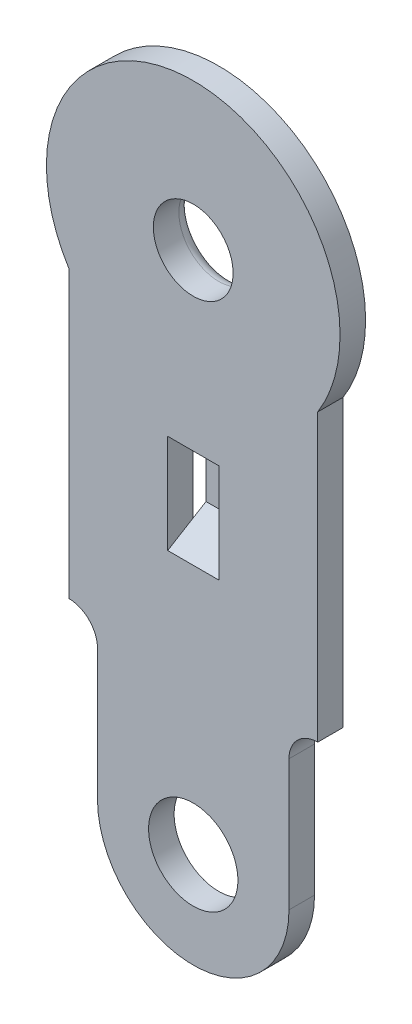
ISO-10303-21;
HEADER;
FILE_DESCRIPTION(('STEP AP214'),'2;1');
FILE_NAME('part.step','',(''),(''),'','','');
FILE_SCHEMA(('AUTOMOTIVE_DESIGN { 1 0 10303 214 1 1 1 1 }'));
ENDSEC;
DATA;
#1=APPLICATION_CONTEXT('core data for automotive mechanical design processes');
#2=APPLICATION_PROTOCOL_DEFINITION('international standard','automotive_design',2000,#1);
#3=PRODUCT_CONTEXT('',#1,'mechanical');
#4=PRODUCT('Part','Part','',(#3));
#5=PRODUCT_RELATED_PRODUCT_CATEGORY('part','',(#4));
#6=PRODUCT_DEFINITION_FORMATION('','',#4);
#7=PRODUCT_DEFINITION_CONTEXT('part definition',#1,'design');
#8=PRODUCT_DEFINITION('design','',#6,#7);
#9=PRODUCT_DEFINITION_SHAPE('','',#8);
#10=(LENGTH_UNIT() NAMED_UNIT(*) SI_UNIT(.MILLI.,.METRE.));
#11=(NAMED_UNIT(*) PLANE_ANGLE_UNIT() SI_UNIT($,.RADIAN.));
#12=(NAMED_UNIT(*) SI_UNIT($,.STERADIAN.) SOLID_ANGLE_UNIT());
#13=UNCERTAINTY_MEASURE_WITH_UNIT(LENGTH_MEASURE(1.E-05),#10,'distance_accuracy_value','');
#14=(GEOMETRIC_REPRESENTATION_CONTEXT(3) GLOBAL_UNCERTAINTY_ASSIGNED_CONTEXT((#13)) GLOBAL_UNIT_ASSIGNED_CONTEXT((#10,
#11,#12)) REPRESENTATION_CONTEXT('',''));
#15=CARTESIAN_POINT('',(0.,0.,0.));
#16=DIRECTION('',(0.,0.,1.));
#17=DIRECTION('',(1.,0.,0.));
#18=AXIS2_PLACEMENT_3D('',#15,#16,#17);
#19=CARTESIAN_POINT('',(0.4,-4.926669023956,-2.993348007763));
#20=DIRECTION('',(0.,-0.854621552333113,-0.519251386409069));
#21=DIRECTION('',(0.,0.519251386409069,-0.854621552333113));
#22=AXIS2_PLACEMENT_3D('',#19,#20,#21);
#23=PLANE('',#22);
#24=DIRECTION('',(0.,0.519251386403896,-0.854621552336256));
#25=VECTOR('',#24,1.);
#26=CARTESIAN_POINT('',(-0.4,1.787628044287,-14.04422458407));
#27=LINE('',#26,#25);
#28=CARTESIAN_POINT('',(-0.4,1.78762804428744,-14.0442245840744));
#29=VERTEX_POINT('',#28);
#30=CARTESIAN_POINT('',(-0.4,1.97692025313756,-14.3557754159206));
#31=VERTEX_POINT('',#30);
#32=EDGE_CURVE('E254',#29,#31,#27,.T.);
#33=ORIENTED_EDGE('',*,*,#32,.T.);
#34=DIRECTION('',(1.,0.,0.));
#35=VECTOR('',#34,1.);
#36=CARTESIAN_POINT('',(0.4,1.97692025313684,-14.3557754159207));
#37=LINE('',#36,#35);
#38=CARTESIAN_POINT('',(0.4,1.97692025313756,-14.3557754159206));
#39=VERTEX_POINT('',#38);
#40=EDGE_CURVE('E419',#39,#31,#37,.F.);
#41=ORIENTED_EDGE('',*,*,#40,.F.);
#42=DIRECTION('',(0.,0.519251386403896,-0.854621552336256));
#43=VECTOR('',#42,1.);
#44=CARTESIAN_POINT('',(0.4,1.787628044287,-14.04422458407));
#45=LINE('',#44,#43);
#46=CARTESIAN_POINT('',(0.4,1.78762804428744,-14.0442245840744));
#47=VERTEX_POINT('',#46);
#48=EDGE_CURVE('E207',#47,#39,#45,.T.);
#49=ORIENTED_EDGE('',*,*,#48,.F.);
#50=DIRECTION('',(-1.,0.,0.));
#51=VECTOR('',#50,1.);
#52=CARTESIAN_POINT('',(0.4,1.78762804428372,-14.044224584072));
#53=LINE('',#52,#51);
#54=EDGE_CURVE('E199',#47,#29,#53,.T.);
#55=ORIENTED_EDGE('',*,*,#54,.T.);
#56=EDGE_LOOP('',(#33,#41,#49,#55));
#57=FACE_BOUND('',#56,.T.);
#58=ADVANCED_FACE('F17',(#57),#23,.T.);
#59=CARTESIAN_POINT('',(0.4,2.233306718838,-14.2));
#60=DIRECTION('',(1.,0.,0.));
#61=DIRECTION('',(0.,0.,-1.));
#62=AXIS2_PLACEMENT_3D('',#59,#60,#61);
#63=CYLINDRICAL_SURFACE('',#62,0.3);
#64=DIRECTION('',(-1.,0.,0.));
#65=VECTOR('',#64,1.);
#66=CARTESIAN_POINT('',(0.4,2.233306718838,-14.5));
#67=LINE('',#66,#65);
#68=CARTESIAN_POINT('',(0.4,2.233306718838,-14.5));
#69=VERTEX_POINT('',#68);
#70=CARTESIAN_POINT('',(-0.4,2.233306718838,-14.5));
#71=VERTEX_POINT('',#70);
#72=EDGE_CURVE('E417',#69,#71,#67,.T.);
#73=ORIENTED_EDGE('',*,*,#72,.F.);
#74=CARTESIAN_POINT('',(0.4,2.233306718838,-14.2));
#75=DIRECTION('',(1.,0.,0.));
#76=DIRECTION('',(0.,0.,-1.));
#77=AXIS2_PLACEMENT_3D('',#74,#75,#76);
#78=CIRCLE('',#77,0.3);
#79=EDGE_CURVE('E265',#39,#69,#78,.T.);
#80=ORIENTED_EDGE('',*,*,#79,.F.);
#81=ORIENTED_EDGE('',*,*,#40,.T.);
#82=CARTESIAN_POINT('',(-0.4,2.233306718838,-14.2));
#83=DIRECTION('',(1.,0.,0.));
#84=DIRECTION('',(0.,0.,-1.));
#85=AXIS2_PLACEMENT_3D('',#82,#83,#84);
#86=CIRCLE('',#85,0.3);
#87=EDGE_CURVE('E253',#31,#71,#86,.T.);
#88=ORIENTED_EDGE('',*,*,#87,.T.);
#89=EDGE_LOOP('',(#73,#80,#81,#88));
#90=FACE_BOUND('',#89,.T.);
#91=ADVANCED_FACE('F474',(#90),#63,.T.);
#92=CARTESIAN_POINT('',(0.4,0.,-14.5));
#93=DIRECTION('',(0.,0.,-1.));
#94=DIRECTION('',(-1.,0.,0.));
#95=AXIS2_PLACEMENT_3D('',#92,#93,#94);
#96=PLANE('',#95);
#97=DIRECTION('',(1.,0.,0.));
#98=VECTOR('',#97,1.);
#99=CARTESIAN_POINT('',(0.4,3.166693281162,-14.5));
#100=LINE('',#99,#98);
#101=CARTESIAN_POINT('',(0.4,3.166693281162,-14.5));
#102=VERTEX_POINT('',#101);
#103=CARTESIAN_POINT('',(-0.4,3.166693281162,-14.5));
#104=VERTEX_POINT('',#103);
#105=EDGE_CURVE('E415',#102,#104,#100,.F.);
#106=ORIENTED_EDGE('',*,*,#105,.F.);
#107=DIRECTION('',(0.,1.,0.));
#108=VECTOR('',#107,1.);
#109=CARTESIAN_POINT('',(0.4,0.,-14.5));
#110=LINE('',#109,#108);
#111=EDGE_CURVE('E263',#69,#102,#110,.T.);
#112=ORIENTED_EDGE('',*,*,#111,.F.);
#113=ORIENTED_EDGE('',*,*,#72,.T.);
#114=DIRECTION('',(0.,1.,0.));
#115=VECTOR('',#114,1.);
#116=CARTESIAN_POINT('',(-0.4,0.,-14.5));
#117=LINE('',#116,#115);
#118=EDGE_CURVE('E250',#71,#104,#117,.T.);
#119=ORIENTED_EDGE('',*,*,#118,.T.);
#120=EDGE_LOOP('',(#106,#112,#113,#119));
#121=FACE_BOUND('',#120,.T.);
#122=ADVANCED_FACE('F478',(#121),#96,.T.);
#123=CARTESIAN_POINT('',(0.4,3.166693281162,-14.2));
#124=DIRECTION('',(1.,0.,0.));
#125=DIRECTION('',(0.,0.,-1.));
#126=AXIS2_PLACEMENT_3D('',#123,#124,#125);
#127=CYLINDRICAL_SURFACE('',#126,0.3);
#128=DIRECTION('',(1.,0.,0.));
#129=VECTOR('',#128,1.);
#130=CARTESIAN_POINT('',(0.4,3.42307974686397,-14.3557754159212));
#131=LINE('',#130,#129);
#132=CARTESIAN_POINT('',(0.4,3.42307974686284,-14.3557754159208));
#133=VERTEX_POINT('',#132);
#134=CARTESIAN_POINT('',(-0.4,3.42307974686284,-14.3557754159208));
#135=VERTEX_POINT('',#134);
#136=EDGE_CURVE('E413',#133,#135,#131,.F.);
#137=ORIENTED_EDGE('',*,*,#136,.F.);
#138=CARTESIAN_POINT('',(0.4,3.166693281162,-14.2));
#139=DIRECTION('',(1.,0.,0.));
#140=DIRECTION('',(0.,0.,-1.));
#141=AXIS2_PLACEMENT_3D('',#138,#139,#140);
#142=CIRCLE('',#141,0.3);
#143=EDGE_CURVE('E186',#102,#133,#142,.T.);
#144=ORIENTED_EDGE('',*,*,#143,.F.);
#145=ORIENTED_EDGE('',*,*,#105,.T.);
#146=CARTESIAN_POINT('',(-0.4,3.166693281162,-14.2));
#147=DIRECTION('',(1.,0.,0.));
#148=DIRECTION('',(0.,0.,-1.));
#149=AXIS2_PLACEMENT_3D('',#146,#147,#148);
#150=CIRCLE('',#149,0.3);
#151=EDGE_CURVE('E249',#104,#135,#150,.T.);
#152=ORIENTED_EDGE('',*,*,#151,.T.);
#153=EDGE_LOOP('',(#137,#144,#145,#152));
#154=FACE_BOUND('',#153,.T.);
#155=ADVANCED_FACE('F481',(#154),#127,.T.);
#156=CARTESIAN_POINT('',(0.4,8.870710211602,-5.389670507645));
#157=DIRECTION('',(0.,0.854621552333113,-0.519251386409069));
#158=DIRECTION('',(0.,0.519251386409069,0.854621552333113));
#159=AXIS2_PLACEMENT_3D('',#156,#157,#158);
#160=PLANE('',#159);
#161=DIRECTION('',(0.,0.519251386403898,0.854621552336255));
#162=VECTOR('',#161,1.);
#163=CARTESIAN_POINT('',(0.4,3.423079746862,-14.35577541592));
#164=LINE('',#163,#162);
#165=CARTESIAN_POINT('',(0.4,3.61237195571256,-14.0442245840744));
#166=VERTEX_POINT('',#165);
#167=EDGE_CURVE('E179',#133,#166,#164,.T.);
#168=ORIENTED_EDGE('',*,*,#167,.F.);
#169=ORIENTED_EDGE('',*,*,#136,.T.);
#170=DIRECTION('',(0.,0.519251386403898,0.854621552336255));
#171=VECTOR('',#170,1.);
#172=CARTESIAN_POINT('',(-0.4,3.423079746862,-14.35577541592));
#173=LINE('',#172,#171);
#174=CARTESIAN_POINT('',(-0.4,3.61237195571256,-14.0442245840744));
#175=VERTEX_POINT('',#174);
#176=EDGE_CURVE('E194',#135,#175,#173,.T.);
#177=ORIENTED_EDGE('',*,*,#176,.T.);
#178=DIRECTION('',(1.,0.,0.));
#179=VECTOR('',#178,1.);
#180=CARTESIAN_POINT('',(0.4,3.61237195571628,-14.044224584072));
#181=LINE('',#180,#179);
#182=EDGE_CURVE('E191',#175,#166,#181,.T.);
#183=ORIENTED_EDGE('',*,*,#182,.T.);
#184=EDGE_LOOP('',(#168,#169,#177,#183));
#185=FACE_BOUND('',#184,.T.);
#186=ADVANCED_FACE('F192',(#185),#160,.T.);
#187=CARTESIAN_POINT('',(0.4,1.531241578587,-14.2));
#188=DIRECTION('',(-1.,0.,0.));
#189=DIRECTION('',(0.,0.,1.));
#190=AXIS2_PLACEMENT_3D('',#187,#188,#189);
#191=CYLINDRICAL_SURFACE('',#190,0.3);
#192=DIRECTION('',(-1.,0.,0.));
#193=VECTOR('',#192,1.);
#194=CARTESIAN_POINT('',(0.,1.531241578587,-13.9));
#195=LINE('',#194,#193);
#196=CARTESIAN_POINT('',(-0.4,1.531241578587,-13.9));
#197=VERTEX_POINT('',#196);
#198=CARTESIAN_POINT('',(0.4,1.531241578587,-13.9));
#199=VERTEX_POINT('',#198);
#200=EDGE_CURVE('E384',#197,#199,#195,.F.);
#201=ORIENTED_EDGE('',*,*,#200,.F.);
#202=CARTESIAN_POINT('',(-0.4,1.531241578587,-14.2));
#203=DIRECTION('',(-1.,0.,0.));
#204=DIRECTION('',(0.,0.,1.));
#205=AXIS2_PLACEMENT_3D('',#202,#203,#204);
#206=CIRCLE('',#205,0.3);
#207=EDGE_CURVE('E257',#197,#29,#206,.T.);
#208=ORIENTED_EDGE('',*,*,#207,.T.);
#209=ORIENTED_EDGE('',*,*,#54,.F.);
#210=CARTESIAN_POINT('',(0.4,1.531241578587,-14.2));
#211=DIRECTION('',(-1.,0.,0.));
#212=DIRECTION('',(0.,0.,1.));
#213=AXIS2_PLACEMENT_3D('',#210,#211,#212);
#214=CIRCLE('',#213,0.3);
#215=EDGE_CURVE('E204',#199,#47,#214,.T.);
#216=ORIENTED_EDGE('',*,*,#215,.F.);
#217=EDGE_LOOP('',(#201,#208,#209,#216));
#218=FACE_BOUND('',#217,.T.);
#219=ADVANCED_FACE('F756',(#218),#191,.F.);
#220=CARTESIAN_POINT('',(0.4,3.868758421413,-14.2));
#221=DIRECTION('',(1.,0.,0.));
#222=DIRECTION('',(0.,0.,-1.));
#223=AXIS2_PLACEMENT_3D('',#220,#221,#222);
#224=CYLINDRICAL_SURFACE('',#223,0.3);
#225=DIRECTION('',(-1.,0.,0.));
#226=VECTOR('',#225,1.);
#227=CARTESIAN_POINT('',(0.,3.868758421413,-13.9));
#228=LINE('',#227,#226);
#229=CARTESIAN_POINT('',(0.4,3.868758421413,-13.9));
#230=VERTEX_POINT('',#229);
#231=CARTESIAN_POINT('',(-0.4,3.868758421413,-13.9));
#232=VERTEX_POINT('',#231);
#233=EDGE_CURVE('E203',#230,#232,#228,.T.);
#234=ORIENTED_EDGE('',*,*,#233,.F.);
#235=CARTESIAN_POINT('',(0.4,3.868758421413,-14.2));
#236=DIRECTION('',(1.,0.,0.));
#237=DIRECTION('',(0.,0.,-1.));
#238=AXIS2_PLACEMENT_3D('',#235,#236,#237);
#239=CIRCLE('',#238,0.3);
#240=EDGE_CURVE('E183',#166,#230,#239,.F.);
#241=ORIENTED_EDGE('',*,*,#240,.F.);
#242=ORIENTED_EDGE('',*,*,#182,.F.);
#243=CARTESIAN_POINT('',(-0.4,3.868758421413,-14.2));
#244=DIRECTION('',(1.,0.,0.));
#245=DIRECTION('',(0.,0.,-1.));
#246=AXIS2_PLACEMENT_3D('',#243,#244,#245);
#247=CIRCLE('',#246,0.3);
#248=EDGE_CURVE('E248',#175,#232,#247,.F.);
#249=ORIENTED_EDGE('',*,*,#248,.T.);
#250=EDGE_LOOP('',(#234,#241,#242,#249));
#251=FACE_BOUND('',#250,.T.);
#252=ADVANCED_FACE('F202',(#251),#224,.F.);
#253=CARTESIAN_POINT('',(0.,6.2,-13.9));
#254=DIRECTION('',(0.,0.,-1.));
#255=DIRECTION('',(-1.,0.,0.));
#256=AXIS2_PLACEMENT_3D('',#253,#254,#255);
#257=TOROIDAL_SURFACE('',#256,1.3,0.2);
#258=CARTESIAN_POINT('',(0.,6.2,-13.9));
#259=DIRECTION('',(0.,0.,-1.));
#260=DIRECTION('',(-1.,0.,0.));
#261=AXIS2_PLACEMENT_3D('',#258,#259,#260);
#262=CIRCLE('',#261,1.5);
#263=CARTESIAN_POINT('',(-1.5,6.2,-13.9));
#264=VERTEX_POINT('',#263);
#265=EDGE_CURVE('E345',#264,#264,#262,.F.);
#266=ORIENTED_EDGE('',*,*,#265,.F.);
#267=EDGE_LOOP('',(#266));
#268=FACE_BOUND('',#267,.T.);
#269=CARTESIAN_POINT('',(0.,6.2,-14.1));
#270=DIRECTION('',(0.,0.,1.));
#271=DIRECTION('',(-1.,0.,0.));
#272=AXIS2_PLACEMENT_3D('',#269,#270,#271);
#273=CIRCLE('',#272,1.3);
#274=CARTESIAN_POINT('',(1.3,6.2,-14.1));
#275=VERTEX_POINT('',#274);
#276=CARTESIAN_POINT('',(-1.3,6.2,-14.1));
#277=VERTEX_POINT('',#276);
#278=EDGE_CURVE('E188',#275,#277,#273,.F.);
#279=ORIENTED_EDGE('',*,*,#278,.F.);
#280=CARTESIAN_POINT('',(0.,6.2,-14.1));
#281=DIRECTION('',(0.,0.,1.));
#282=DIRECTION('',(1.,0.,0.));
#283=AXIS2_PLACEMENT_3D('',#280,#281,#282);
#284=CIRCLE('',#283,1.3);
#285=EDGE_CURVE('E198',#277,#275,#284,.F.);
#286=ORIENTED_EDGE('',*,*,#285,.F.);
#287=EDGE_LOOP('',(#279,#286));
#288=FACE_BOUND('',#287,.T.);
#289=ADVANCED_FACE('F301',(#268,#288),#257,.T.);
#290=CARTESIAN_POINT('',(0.,6.2,-14.1));
#291=DIRECTION('',(0.,0.,-1.));
#292=DIRECTION('',(-1.,0.,0.));
#293=AXIS2_PLACEMENT_3D('',#290,#291,#292);
#294=PLANE('',#293);
#295=CARTESIAN_POINT('',(0.,6.2,-14.1));
#296=DIRECTION('',(0.,0.,-1.));
#297=DIRECTION('',(1.,0.,0.));
#298=AXIS2_PLACEMENT_3D('',#295,#296,#297);
#299=CIRCLE('',#298,0.825);
#300=CARTESIAN_POINT('',(0.825,6.2,-14.1));
#301=VERTEX_POINT('',#300);
#302=CARTESIAN_POINT('',(-0.825,6.2,-14.1));
#303=VERTEX_POINT('',#302);
#304=EDGE_CURVE('E331',#301,#303,#299,.T.);
#305=ORIENTED_EDGE('',*,*,#304,.F.);
#306=CARTESIAN_POINT('',(0.,6.2,-14.1));
#307=DIRECTION('',(0.,0.,-1.));
#308=DIRECTION('',(-1.,0.,0.));
#309=AXIS2_PLACEMENT_3D('',#306,#307,#308);
#310=CIRCLE('',#309,0.825);
#311=EDGE_CURVE('E214',#303,#301,#310,.T.);
#312=ORIENTED_EDGE('',*,*,#311,.F.);
#313=EDGE_LOOP('',(#305,#312));
#314=FACE_BOUND('',#313,.T.);
#315=ORIENTED_EDGE('',*,*,#285,.T.);
#316=ORIENTED_EDGE('',*,*,#278,.T.);
#317=EDGE_LOOP('',(#315,#316));
#318=FACE_BOUND('',#317,.T.);
#319=ADVANCED_FACE('F292',(#314,#318),#294,.T.);
#320=CARTESIAN_POINT('',(0.4,0.,0.));
#321=DIRECTION('',(1.,0.,0.));
#322=DIRECTION('',(0.,0.,-1.));
#323=AXIS2_PLACEMENT_3D('',#320,#321,#322);
#324=PLANE('',#323);
#325=ORIENTED_EDGE('',*,*,#111,.T.);
#326=ORIENTED_EDGE('',*,*,#143,.T.);
#327=ORIENTED_EDGE('',*,*,#167,.T.);
#328=ORIENTED_EDGE('',*,*,#240,.T.);
#329=DIRECTION('',(0.,1.,0.));
#330=VECTOR('',#329,1.);
#331=CARTESIAN_POINT('',(0.4,6.2,-13.9));
#332=LINE('',#331,#330);
#333=CARTESIAN_POINT('',(0.4,3.23195657316606,-13.9));
#334=VERTEX_POINT('',#333);
#335=EDGE_CURVE('E343',#334,#230,#332,.T.);
#336=ORIENTED_EDGE('',*,*,#335,.F.);
#337=DIRECTION('',(0.,0.519251386409069,0.854621552333113));
#338=VECTOR('',#337,1.);
#339=CARTESIAN_POINT('',(0.4,8.528861590668,-5.181969953082));
#340=LINE('',#339,#338);
#341=CARTESIAN_POINT('',(0.4,3.11044047402501,-14.1));
#342=VERTEX_POINT('',#341);
#343=EDGE_CURVE('E376',#334,#342,#340,.F.);
#344=ORIENTED_EDGE('',*,*,#343,.T.);
#345=DIRECTION('',(0.,1.,0.));
#346=VECTOR('',#345,1.);
#347=CARTESIAN_POINT('',(0.4,0.,-14.1));
#348=LINE('',#347,#346);
#349=CARTESIAN_POINT('',(0.4,2.28955952597479,-14.1000000000001));
#350=VERTEX_POINT('',#349);
#351=EDGE_CURVE('E260',#342,#350,#348,.F.);
#352=ORIENTED_EDGE('',*,*,#351,.T.);
#353=DIRECTION('',(0.,0.519251386409069,-0.854621552333113));
#354=VECTOR('',#353,1.);
#355=CARTESIAN_POINT('',(0.4,-4.584820403023,-2.7856474532));
#356=LINE('',#355,#354);
#357=CARTESIAN_POINT('',(0.4,2.16804342683369,-13.9));
#358=VERTEX_POINT('',#357);
#359=EDGE_CURVE('E351',#350,#358,#356,.F.);
#360=ORIENTED_EDGE('',*,*,#359,.T.);
#361=DIRECTION('',(0.,1.,0.));
#362=VECTOR('',#361,1.);
#363=CARTESIAN_POINT('',(0.4,6.2,-13.9));
#364=LINE('',#363,#362);
#365=EDGE_CURVE('E367',#199,#358,#364,.T.);
#366=ORIENTED_EDGE('',*,*,#365,.F.);
#367=ORIENTED_EDGE('',*,*,#215,.T.);
#368=ORIENTED_EDGE('',*,*,#48,.T.);
#369=ORIENTED_EDGE('',*,*,#79,.T.);
#370=EDGE_LOOP('',(#325,#326,#327,#328,#336,#344,#352,#360,#366,#367,#368,#369));
#371=FACE_BOUND('',#370,.T.);
#372=ADVANCED_FACE('F181',(#371),#324,.T.);
#373=CARTESIAN_POINT('',(0.4,0.,-14.1));
#374=DIRECTION('',(0.,0.,-1.));
#375=DIRECTION('',(-1.,0.,0.));
#376=AXIS2_PLACEMENT_3D('',#373,#374,#375);
#377=PLANE('',#376);
#378=DIRECTION('',(0.,1.,0.));
#379=VECTOR('',#378,1.);
#380=CARTESIAN_POINT('',(-0.4,0.,-14.1));
#381=LINE('',#380,#379);
#382=CARTESIAN_POINT('',(-0.4,3.11044047402501,-14.1));
#383=VERTEX_POINT('',#382);
#384=CARTESIAN_POINT('',(-0.4,2.28955952597479,-14.1000000000001));
#385=VERTEX_POINT('',#384);
#386=EDGE_CURVE('E258',#383,#385,#381,.F.);
#387=ORIENTED_EDGE('',*,*,#386,.T.);
#388=DIRECTION('',(1.,0.,0.));
#389=VECTOR('',#388,1.);
#390=CARTESIAN_POINT('',(0.4,2.28955952597416,-14.1000000000005));
#391=LINE('',#390,#389);
#392=EDGE_CURVE('E397',#385,#350,#391,.T.);
#393=ORIENTED_EDGE('',*,*,#392,.T.);
#394=ORIENTED_EDGE('',*,*,#351,.F.);
#395=DIRECTION('',(1.,0.,0.));
#396=VECTOR('',#395,1.);
#397=CARTESIAN_POINT('',(0.4,3.11044047402505,-14.1));
#398=LINE('',#397,#396);
#399=EDGE_CURVE('E363',#342,#383,#398,.F.);
#400=ORIENTED_EDGE('',*,*,#399,.T.);
#401=EDGE_LOOP('',(#387,#393,#394,#400));
#402=FACE_BOUND('',#401,.T.);
#403=ADVANCED_FACE('F723',(#402),#377,.F.);
#404=CARTESIAN_POINT('',(-0.4,0.,0.));
#405=DIRECTION('',(1.,0.,0.));
#406=DIRECTION('',(0.,0.,-1.));
#407=AXIS2_PLACEMENT_3D('',#404,#405,#406);
#408=PLANE('',#407);
#409=ORIENTED_EDGE('',*,*,#248,.F.);
#410=ORIENTED_EDGE('',*,*,#176,.F.);
#411=ORIENTED_EDGE('',*,*,#151,.F.);
#412=ORIENTED_EDGE('',*,*,#118,.F.);
#413=ORIENTED_EDGE('',*,*,#87,.F.);
#414=ORIENTED_EDGE('',*,*,#32,.F.);
#415=ORIENTED_EDGE('',*,*,#207,.F.);
#416=DIRECTION('',(0.,1.,0.));
#417=VECTOR('',#416,1.);
#418=CARTESIAN_POINT('',(-0.4,6.2,-13.9));
#419=LINE('',#418,#417);
#420=CARTESIAN_POINT('',(-0.4,2.16804342683384,-13.9));
#421=VERTEX_POINT('',#420);
#422=EDGE_CURVE('E386',#421,#197,#419,.F.);
#423=ORIENTED_EDGE('',*,*,#422,.F.);
#424=DIRECTION('',(0.,0.519251386409069,-0.854621552333113));
#425=VECTOR('',#424,1.);
#426=CARTESIAN_POINT('',(-0.4,-4.584820403023,-2.7856474532));
#427=LINE('',#426,#425);
#428=EDGE_CURVE('E404',#421,#385,#427,.T.);
#429=ORIENTED_EDGE('',*,*,#428,.T.);
#430=ORIENTED_EDGE('',*,*,#386,.F.);
#431=DIRECTION('',(0.,0.519251386409069,0.854621552333113));
#432=VECTOR('',#431,1.);
#433=CARTESIAN_POINT('',(-0.4,8.528861590668,-5.181969953082));
#434=LINE('',#433,#432);
#435=CARTESIAN_POINT('',(-0.4,3.23195657316606,-13.9));
#436=VERTEX_POINT('',#435);
#437=EDGE_CURVE('E358',#383,#436,#434,.T.);
#438=ORIENTED_EDGE('',*,*,#437,.T.);
#439=DIRECTION('',(0.,1.,0.));
#440=VECTOR('',#439,1.);
#441=CARTESIAN_POINT('',(-0.4,6.2,-13.9));
#442=LINE('',#441,#440);
#443=EDGE_CURVE('E342',#232,#436,#442,.F.);
#444=ORIENTED_EDGE('',*,*,#443,.F.);
#445=EDGE_LOOP('',(#409,#410,#411,#412,#413,#414,#415,#423,#429,#430,#438,#444));
#446=FACE_BOUND('',#445,.T.);
#447=ADVANCED_FACE('F483',(#446),#408,.F.);
#448=CARTESIAN_POINT('',(0.,6.2,-13.9));
#449=DIRECTION('',(0.,0.,-1.));
#450=DIRECTION('',(-1.,0.,0.));
#451=AXIS2_PLACEMENT_3D('',#448,#449,#450);
#452=PLANE('',#451);
#453=ORIENTED_EDGE('',*,*,#265,.T.);
#454=EDGE_LOOP('',(#453));
#455=FACE_BOUND('',#454,.T.);
#456=CARTESIAN_POINT('',(0.,-2.,-13.9));
#457=DIRECTION('',(0.,0.,-1.));
#458=DIRECTION('',(-1.,0.,0.));
#459=AXIS2_PLACEMENT_3D('',#456,#457,#458);
#460=CIRCLE('',#459,0.7);
#461=CARTESIAN_POINT('',(-0.7,-2.,-13.9));
#462=VERTEX_POINT('',#461);
#463=EDGE_CURVE('E246',#462,#462,#460,.F.);
#464=ORIENTED_EDGE('',*,*,#463,.T.);
#465=EDGE_LOOP('',(#464));
#466=FACE_BOUND('',#465,.T.);
#467=ORIENTED_EDGE('',*,*,#443,.T.);
#468=DIRECTION('',(0.,-1.,0.));
#469=VECTOR('',#468,1.);
#470=CARTESIAN_POINT('',(-0.4,3.7,-13.9));
#471=LINE('',#470,#469);
#472=EDGE_CURVE('E348',#436,#421,#471,.T.);
#473=ORIENTED_EDGE('',*,*,#472,.T.);
#474=ORIENTED_EDGE('',*,*,#422,.T.);
#475=ORIENTED_EDGE('',*,*,#200,.T.);
#476=ORIENTED_EDGE('',*,*,#365,.T.);
#477=DIRECTION('',(0.,1.,0.));
#478=VECTOR('',#477,1.);
#479=CARTESIAN_POINT('',(0.4,3.7,-13.9));
#480=LINE('',#479,#478);
#481=EDGE_CURVE('E370',#358,#334,#480,.T.);
#482=ORIENTED_EDGE('',*,*,#481,.T.);
#483=ORIENTED_EDGE('',*,*,#335,.T.);
#484=ORIENTED_EDGE('',*,*,#233,.T.);
#485=EDGE_LOOP('',(#467,#473,#474,#475,#476,#482,#483,#484));
#486=FACE_BOUND('',#485,.T.);
#487=CARTESIAN_POINT('',(-1.95,0.05,-13.9));
#488=DIRECTION('',(0.,0.,-1.));
#489=DIRECTION('',(-1.,0.,0.));
#490=AXIS2_PLACEMENT_3D('',#487,#488,#489);
#491=CIRCLE('',#490,0.45);
#492=CARTESIAN_POINT('',(-1.5,0.05,-13.9));
#493=VERTEX_POINT('',#492);
#494=CARTESIAN_POINT('',(-1.95,0.5,-13.9));
#495=VERTEX_POINT('',#494);
#496=EDGE_CURVE('E452',#493,#495,#491,.F.);
#497=ORIENTED_EDGE('',*,*,#496,.T.);
#498=DIRECTION('',(0.,1.,0.));
#499=VECTOR('',#498,1.);
#500=CARTESIAN_POINT('',(-1.95,4.980368908235,-13.9));
#501=LINE('',#500,#499);
#502=CARTESIAN_POINT('',(-1.95000000000001,4.98036890823497,-13.9));
#503=VERTEX_POINT('',#502);
#504=EDGE_CURVE('E267',#495,#503,#501,.T.);
#505=ORIENTED_EDGE('',*,*,#504,.T.);
#506=CARTESIAN_POINT('',(0.,6.2,-13.9));
#507=DIRECTION('',(0.,0.,-1.));
#508=DIRECTION('',(-1.,0.,0.));
#509=AXIS2_PLACEMENT_3D('',#506,#507,#508);
#510=CIRCLE('',#509,2.3);
#511=CARTESIAN_POINT('',(1.95,4.98036890823498,-13.9));
#512=VERTEX_POINT('',#511);
#513=EDGE_CURVE('E270',#512,#503,#510,.F.);
#514=ORIENTED_EDGE('',*,*,#513,.F.);
#515=DIRECTION('',(0.,-1.,0.));
#516=VECTOR('',#515,1.);
#517=CARTESIAN_POINT('',(1.95,4.980368908235,-13.9));
#518=LINE('',#517,#516);
#519=CARTESIAN_POINT('',(1.95,0.5,-13.9));
#520=VERTEX_POINT('',#519);
#521=EDGE_CURVE('E281',#512,#520,#518,.T.);
#522=ORIENTED_EDGE('',*,*,#521,.T.);
#523=CARTESIAN_POINT('',(1.95,0.05,-13.9));
#524=DIRECTION('',(0.,0.,-1.));
#525=DIRECTION('',(-1.,0.,0.));
#526=AXIS2_PLACEMENT_3D('',#523,#524,#525);
#527=CIRCLE('',#526,0.45);
#528=CARTESIAN_POINT('',(1.5,0.05,-13.9));
#529=VERTEX_POINT('',#528);
#530=EDGE_CURVE('E456',#520,#529,#527,.F.);
#531=ORIENTED_EDGE('',*,*,#530,.T.);
#532=DIRECTION('',(0.,1.,0.));
#533=VECTOR('',#532,1.);
#534=CARTESIAN_POINT('',(1.5,0.05,-13.9));
#535=LINE('',#534,#533);
#536=CARTESIAN_POINT('',(1.5,-2.,-13.9));
#537=VERTEX_POINT('',#536);
#538=EDGE_CURVE('E276',#529,#537,#535,.F.);
#539=ORIENTED_EDGE('',*,*,#538,.T.);
#540=CARTESIAN_POINT('',(0.,-2.,-13.9));
#541=DIRECTION('',(0.,0.,-1.));
#542=DIRECTION('',(-1.,0.,0.));
#543=AXIS2_PLACEMENT_3D('',#540,#541,#542);
#544=CIRCLE('',#543,1.5);
#545=CARTESIAN_POINT('',(-1.5,-2.,-13.9));
#546=VERTEX_POINT('',#545);
#547=EDGE_CURVE('E279',#546,#537,#544,.F.);
#548=ORIENTED_EDGE('',*,*,#547,.F.);
#549=DIRECTION('',(0.,1.,0.));
#550=VECTOR('',#549,1.);
#551=CARTESIAN_POINT('',(-1.5,0.05,-13.9));
#552=LINE('',#551,#550);
#553=EDGE_CURVE('E272',#546,#493,#552,.T.);
#554=ORIENTED_EDGE('',*,*,#553,.T.);
#555=EDGE_LOOP('',(#497,#505,#514,#522,#531,#539,#548,#554));
#556=FACE_BOUND('',#555,.T.);
#557=ADVANCED_FACE('F232',(#455,#466,#486,#556),#452,.T.);
#558=CARTESIAN_POINT('',(0.,6.2,-13.9));
#559=DIRECTION('',(0.,0.,-1.));
#560=DIRECTION('',(-1.,0.,0.));
#561=AXIS2_PLACEMENT_3D('',#558,#559,#560);
#562=TOROIDAL_SURFACE('',#561,0.825,0.2);
#563=ORIENTED_EDGE('',*,*,#311,.T.);
#564=ORIENTED_EDGE('',*,*,#304,.T.);
#565=EDGE_LOOP('',(#563,#564));
#566=FACE_BOUND('',#565,.T.);
#567=CARTESIAN_POINT('',(0.,6.2,-13.9));
#568=DIRECTION('',(0.,0.,-1.));
#569=DIRECTION('',(-1.,0.,0.));
#570=AXIS2_PLACEMENT_3D('',#567,#568,#569);
#571=CIRCLE('',#570,0.625);
#572=CARTESIAN_POINT('',(-0.625,6.2,-13.9));
#573=VERTEX_POINT('',#572);
#574=EDGE_CURVE('E242',#573,#573,#571,.F.);
#575=ORIENTED_EDGE('',*,*,#574,.T.);
#576=EDGE_LOOP('',(#575));
#577=FACE_BOUND('',#576,.T.);
#578=ADVANCED_FACE('F220',(#566,#577),#562,.T.);
#579=CARTESIAN_POINT('',(1.95,4.980368908235,-13.9));
#580=DIRECTION('',(-1.,0.,0.));
#581=DIRECTION('',(0.,-1.,0.));
#582=AXIS2_PLACEMENT_3D('',#579,#580,#581);
#583=PLANE('',#582);
#584=DIRECTION('',(0.,0.,-1.));
#585=VECTOR('',#584,1.);
#586=CARTESIAN_POINT('',(1.95,0.5,-13.9));
#587=LINE('',#586,#585);
#588=CARTESIAN_POINT('',(1.95,0.5,-13.5));
#589=VERTEX_POINT('',#588);
#590=EDGE_CURVE('E283',#589,#520,#587,.T.);
#591=ORIENTED_EDGE('',*,*,#590,.T.);
#592=ORIENTED_EDGE('',*,*,#521,.F.);
#593=DIRECTION('',(0.,0.,1.));
#594=VECTOR('',#593,1.);
#595=CARTESIAN_POINT('',(1.95,4.980368908235,-13.9));
#596=LINE('',#595,#594);
#597=CARTESIAN_POINT('',(1.95,4.98036890823498,-13.5));
#598=VERTEX_POINT('',#597);
#599=EDGE_CURVE('E240',#598,#512,#596,.F.);
#600=ORIENTED_EDGE('',*,*,#599,.F.);
#601=DIRECTION('',(0.,1.,0.));
#602=VECTOR('',#601,1.);
#603=CARTESIAN_POINT('',(1.95,6.2,-13.5));
#604=LINE('',#603,#602);
#605=EDGE_CURVE('E447',#598,#589,#604,.F.);
#606=ORIENTED_EDGE('',*,*,#605,.T.);
#607=EDGE_LOOP('',(#591,#592,#600,#606));
#608=FACE_BOUND('',#607,.T.);
#609=ADVANCED_FACE('F231',(#608),#583,.F.);
#610=CARTESIAN_POINT('',(1.95,0.05,-13.9));
#611=DIRECTION('',(0.,0.,-1.));
#612=DIRECTION('',(-1.,0.,0.));
#613=AXIS2_PLACEMENT_3D('',#610,#611,#612);
#614=CYLINDRICAL_SURFACE('',#613,0.45);
#615=DIRECTION('',(0.,0.,1.));
#616=VECTOR('',#615,1.);
#617=CARTESIAN_POINT('',(1.5,0.05,-13.9));
#618=LINE('',#617,#616);
#619=CARTESIAN_POINT('',(1.5,0.0499999999999999,-13.5));
#620=VERTEX_POINT('',#619);
#621=EDGE_CURVE('E280',#620,#529,#618,.F.);
#622=ORIENTED_EDGE('',*,*,#621,.T.);
#623=ORIENTED_EDGE('',*,*,#530,.F.);
#624=ORIENTED_EDGE('',*,*,#590,.F.);
#625=CARTESIAN_POINT('',(1.95,0.05,-13.5));
#626=DIRECTION('',(0.,0.,-1.));
#627=DIRECTION('',(-1.,0.,0.));
#628=AXIS2_PLACEMENT_3D('',#625,#626,#627);
#629=CIRCLE('',#628,0.45);
#630=EDGE_CURVE('E444',#589,#620,#629,.F.);
#631=ORIENTED_EDGE('',*,*,#630,.T.);
#632=EDGE_LOOP('',(#622,#623,#624,#631));
#633=FACE_BOUND('',#632,.T.);
#634=ADVANCED_FACE('F539',(#633),#614,.F.);
#635=CARTESIAN_POINT('',(1.5,0.05,-13.9));
#636=DIRECTION('',(-1.,0.,0.));
#637=DIRECTION('',(0.,0.,1.));
#638=AXIS2_PLACEMENT_3D('',#635,#636,#637);
#639=PLANE('',#638);
#640=DIRECTION('',(0.,0.,-1.));
#641=VECTOR('',#640,1.);
#642=CARTESIAN_POINT('',(1.5,-2.,-13.9));
#643=LINE('',#642,#641);
#644=CARTESIAN_POINT('',(1.5,-2.,-13.5));
#645=VERTEX_POINT('',#644);
#646=EDGE_CURVE('E455',#537,#645,#643,.F.);
#647=ORIENTED_EDGE('',*,*,#646,.F.);
#648=ORIENTED_EDGE('',*,*,#538,.F.);
#649=ORIENTED_EDGE('',*,*,#621,.F.);
#650=DIRECTION('',(0.,1.,0.));
#651=VECTOR('',#650,1.);
#652=CARTESIAN_POINT('',(1.5,6.2,-13.5));
#653=LINE('',#652,#651);
#654=EDGE_CURVE('E443',#620,#645,#653,.F.);
#655=ORIENTED_EDGE('',*,*,#654,.T.);
#656=EDGE_LOOP('',(#647,#648,#649,#655));
#657=FACE_BOUND('',#656,.T.);
#658=ADVANCED_FACE('F548',(#657),#639,.F.);
#659=CARTESIAN_POINT('',(0.,-2.,-13.9));
#660=DIRECTION('',(0.,0.,-1.));
#661=DIRECTION('',(-1.,0.,0.));
#662=AXIS2_PLACEMENT_3D('',#659,#660,#661);
#663=CYLINDRICAL_SURFACE('',#662,1.5);
#664=ORIENTED_EDGE('',*,*,#547,.T.);
#665=ORIENTED_EDGE('',*,*,#646,.T.);
#666=CARTESIAN_POINT('',(0.,-2.,-13.5));
#667=DIRECTION('',(0.,0.,-1.));
#668=DIRECTION('',(-1.,0.,0.));
#669=AXIS2_PLACEMENT_3D('',#666,#667,#668);
#670=CIRCLE('',#669,1.5);
#671=CARTESIAN_POINT('',(-1.5,-2.,-13.5));
#672=VERTEX_POINT('',#671);
#673=EDGE_CURVE('E440',#645,#672,#670,.T.);
#674=ORIENTED_EDGE('',*,*,#673,.T.);
#675=DIRECTION('',(0.,0.,-1.));
#676=VECTOR('',#675,1.);
#677=CARTESIAN_POINT('',(-1.5,-2.,-13.9));
#678=LINE('',#677,#676);
#679=EDGE_CURVE('E275',#672,#546,#678,.T.);
#680=ORIENTED_EDGE('',*,*,#679,.T.);
#681=EDGE_LOOP('',(#664,#665,#674,#680));
#682=FACE_BOUND('',#681,.T.);
#683=ADVANCED_FACE('F563',(#682),#663,.T.);
#684=CARTESIAN_POINT('',(-1.5,0.05,-13.9));
#685=DIRECTION('',(1.,0.,0.));
#686=DIRECTION('',(0.,0.,-1.));
#687=AXIS2_PLACEMENT_3D('',#684,#685,#686);
#688=PLANE('',#687);
#689=DIRECTION('',(0.,0.,-1.));
#690=VECTOR('',#689,1.);
#691=CARTESIAN_POINT('',(-1.5,0.0500000000000001,-13.9));
#692=LINE('',#691,#690);
#693=CARTESIAN_POINT('',(-1.5,0.05,-13.5));
#694=VERTEX_POINT('',#693);
#695=EDGE_CURVE('E274',#694,#493,#692,.T.);
#696=ORIENTED_EDGE('',*,*,#695,.T.);
#697=ORIENTED_EDGE('',*,*,#553,.F.);
#698=ORIENTED_EDGE('',*,*,#679,.F.);
#699=DIRECTION('',(0.,1.,0.));
#700=VECTOR('',#699,1.);
#701=CARTESIAN_POINT('',(-1.5,6.2,-13.5));
#702=LINE('',#701,#700);
#703=EDGE_CURVE('E439',#672,#694,#702,.T.);
#704=ORIENTED_EDGE('',*,*,#703,.T.);
#705=EDGE_LOOP('',(#696,#697,#698,#704));
#706=FACE_BOUND('',#705,.T.);
#707=ADVANCED_FACE('F561',(#706),#688,.F.);
#708=CARTESIAN_POINT('',(-1.95,0.05,-13.9));
#709=DIRECTION('',(0.,0.,-1.));
#710=DIRECTION('',(-1.,0.,0.));
#711=AXIS2_PLACEMENT_3D('',#708,#709,#710);
#712=CYLINDRICAL_SURFACE('',#711,0.45);
#713=DIRECTION('',(0.,0.,-1.));
#714=VECTOR('',#713,1.);
#715=CARTESIAN_POINT('',(-1.95,0.5,-13.9));
#716=LINE('',#715,#714);
#717=CARTESIAN_POINT('',(-1.95,0.5,-13.5));
#718=VERTEX_POINT('',#717);
#719=EDGE_CURVE('E271',#718,#495,#716,.T.);
#720=ORIENTED_EDGE('',*,*,#719,.T.);
#721=ORIENTED_EDGE('',*,*,#496,.F.);
#722=ORIENTED_EDGE('',*,*,#695,.F.);
#723=CARTESIAN_POINT('',(-1.95,0.05,-13.5));
#724=DIRECTION('',(0.,0.,-1.));
#725=DIRECTION('',(-1.,0.,0.));
#726=AXIS2_PLACEMENT_3D('',#723,#724,#725);
#727=CIRCLE('',#726,0.45);
#728=EDGE_CURVE('E435',#694,#718,#727,.F.);
#729=ORIENTED_EDGE('',*,*,#728,.T.);
#730=EDGE_LOOP('',(#720,#721,#722,#729));
#731=FACE_BOUND('',#730,.T.);
#732=ADVANCED_FACE('F558',(#731),#712,.F.);
#733=CARTESIAN_POINT('',(-1.95,4.980368908235,-13.9));
#734=DIRECTION('',(1.,0.,0.));
#735=DIRECTION('',(0.,0.,-1.));
#736=AXIS2_PLACEMENT_3D('',#733,#734,#735);
#737=PLANE('',#736);
#738=DIRECTION('',(0.,0.,-1.));
#739=VECTOR('',#738,1.);
#740=CARTESIAN_POINT('',(-1.95000000000002,4.98036890823499,-13.9));
#741=LINE('',#740,#739);
#742=CARTESIAN_POINT('',(-1.95000000000001,4.98036890823497,-13.5));
#743=VERTEX_POINT('',#742);
#744=EDGE_CURVE('E352',#503,#743,#741,.F.);
#745=ORIENTED_EDGE('',*,*,#744,.F.);
#746=ORIENTED_EDGE('',*,*,#504,.F.);
#747=ORIENTED_EDGE('',*,*,#719,.F.);
#748=DIRECTION('',(0.,1.,0.));
#749=VECTOR('',#748,1.);
#750=CARTESIAN_POINT('',(-1.95,6.2,-13.5));
#751=LINE('',#750,#749);
#752=EDGE_CURVE('E438',#718,#743,#751,.T.);
#753=ORIENTED_EDGE('',*,*,#752,.T.);
#754=EDGE_LOOP('',(#745,#746,#747,#753));
#755=FACE_BOUND('',#754,.T.);
#756=ADVANCED_FACE('F603',(#755),#737,.F.);
#757=CARTESIAN_POINT('',(0.,6.2,-13.9));
#758=DIRECTION('',(0.,0.,-1.));
#759=DIRECTION('',(-1.,0.,0.));
#760=AXIS2_PLACEMENT_3D('',#757,#758,#759);
#761=CYLINDRICAL_SURFACE('',#760,2.3);
#762=ORIENTED_EDGE('',*,*,#744,.T.);
#763=CARTESIAN_POINT('',(0.,6.2,-13.5));
#764=DIRECTION('',(0.,0.,-1.));
#765=DIRECTION('',(-1.,0.,0.));
#766=AXIS2_PLACEMENT_3D('',#763,#764,#765);
#767=CIRCLE('',#766,2.3);
#768=EDGE_CURVE('E245',#743,#598,#767,.T.);
#769=ORIENTED_EDGE('',*,*,#768,.T.);
#770=ORIENTED_EDGE('',*,*,#599,.T.);
#771=ORIENTED_EDGE('',*,*,#513,.T.);
#772=EDGE_LOOP('',(#762,#769,#770,#771));
#773=FACE_BOUND('',#772,.T.);
#774=ADVANCED_FACE('F554',(#773),#761,.T.);
#775=CARTESIAN_POINT('',(-0.4,3.7,-13.5));
#776=DIRECTION('',(-1.,0.,0.));
#777=DIRECTION('',(0.,-1.,0.));
#778=AXIS2_PLACEMENT_3D('',#775,#776,#777);
#779=PLANE('',#778);
#780=DIRECTION('',(0.,1.,0.));
#781=VECTOR('',#780,1.);
#782=CARTESIAN_POINT('',(-0.4,6.2,-13.5));
#783=LINE('',#782,#781);
#784=CARTESIAN_POINT('',(-0.4,3.47498877144913,-13.5000000000001));
#785=VERTEX_POINT('',#784);
#786=CARTESIAN_POINT('',(-0.4,1.92501122855067,-13.5000000000002));
#787=VERTEX_POINT('',#786);
#788=EDGE_CURVE('E507',#785,#787,#783,.F.);
#789=ORIENTED_EDGE('',*,*,#788,.T.);
#790=DIRECTION('',(0.,0.519251386409069,-0.854621552333113));
#791=VECTOR('',#790,1.);
#792=CARTESIAN_POINT('',(-0.4,-4.584820403023,-2.7856474532));
#793=LINE('',#792,#791);
#794=EDGE_CURVE('E392',#787,#421,#793,.T.);
#795=ORIENTED_EDGE('',*,*,#794,.T.);
#796=ORIENTED_EDGE('',*,*,#472,.F.);
#797=DIRECTION('',(0.,0.519251386409069,0.854621552333113));
#798=VECTOR('',#797,1.);
#799=CARTESIAN_POINT('',(-0.4,8.528861590668,-5.181969953082));
#800=LINE('',#799,#798);
#801=EDGE_CURVE('E355',#436,#785,#800,.T.);
#802=ORIENTED_EDGE('',*,*,#801,.T.);
#803=EDGE_LOOP('',(#789,#795,#796,#802));
#804=FACE_BOUND('',#803,.T.);
#805=ADVANCED_FACE('F493',(#804),#779,.F.);
#806=CARTESIAN_POINT('',(0.4,-4.584820403023,-2.7856474532));
#807=DIRECTION('',(0.,-0.854621552333113,-0.519251386409069));
#808=DIRECTION('',(0.,0.519251386409069,-0.854621552333113));
#809=AXIS2_PLACEMENT_3D('',#806,#807,#808);
#810=PLANE('',#809);
#811=ORIENTED_EDGE('',*,*,#428,.F.);
#812=ORIENTED_EDGE('',*,*,#794,.F.);
#813=DIRECTION('',(-1.,0.,0.));
#814=VECTOR('',#813,1.);
#815=CARTESIAN_POINT('',(0.,1.925011228551,-13.5));
#816=LINE('',#815,#814);
#817=CARTESIAN_POINT('',(0.4,1.92501122855034,-13.5000000000004));
#818=VERTEX_POINT('',#817);
#819=EDGE_CURVE('E502',#787,#818,#816,.F.);
#820=ORIENTED_EDGE('',*,*,#819,.T.);
#821=DIRECTION('',(0.,0.51925138640892,-0.854621552333203));
#822=VECTOR('',#821,1.);
#823=CARTESIAN_POINT('',(0.4,1.925011228551,-13.5));
#824=LINE('',#823,#822);
#825=EDGE_CURVE('E373',#818,#358,#824,.T.);
#826=ORIENTED_EDGE('',*,*,#825,.T.);
#827=ORIENTED_EDGE('',*,*,#359,.F.);
#828=ORIENTED_EDGE('',*,*,#392,.F.);
#829=EDGE_LOOP('',(#811,#812,#820,#826,#827,#828));
#830=FACE_BOUND('',#829,.T.);
#831=ADVANCED_FACE('F594',(#830),#810,.F.);
#832=CARTESIAN_POINT('',(0.4,3.7,-13.5));
#833=DIRECTION('',(1.,0.,0.));
#834=DIRECTION('',(0.,1.,0.));
#835=AXIS2_PLACEMENT_3D('',#832,#833,#834);
#836=PLANE('',#835);
#837=ORIENTED_EDGE('',*,*,#481,.F.);
#838=ORIENTED_EDGE('',*,*,#825,.F.);
#839=DIRECTION('',(0.,1.,0.));
#840=VECTOR('',#839,1.);
#841=CARTESIAN_POINT('',(0.4,6.2,-13.5));
#842=LINE('',#841,#840);
#843=CARTESIAN_POINT('',(0.4,3.47498877144913,-13.5000000000001));
#844=VERTEX_POINT('',#843);
#845=EDGE_CURVE('E500',#818,#844,#842,.T.);
#846=ORIENTED_EDGE('',*,*,#845,.T.);
#847=DIRECTION('',(0.,0.519251386409069,0.854621552333113));
#848=VECTOR('',#847,1.);
#849=CARTESIAN_POINT('',(0.4,8.528861590668,-5.181969953082));
#850=LINE('',#849,#848);
#851=EDGE_CURVE('E37',#844,#334,#850,.F.);
#852=ORIENTED_EDGE('',*,*,#851,.T.);
#853=EDGE_LOOP('',(#837,#838,#846,#852));
#854=FACE_BOUND('',#853,.T.);
#855=ADVANCED_FACE('F591',(#854),#836,.F.);
#856=CARTESIAN_POINT('',(0.4,8.528861590668,-5.181969953082));
#857=DIRECTION('',(0.,0.854621552333113,-0.519251386409069));
#858=DIRECTION('',(0.,0.519251386409069,0.854621552333113));
#859=AXIS2_PLACEMENT_3D('',#856,#857,#858);
#860=PLANE('',#859);
#861=ORIENTED_EDGE('',*,*,#801,.F.);
#862=ORIENTED_EDGE('',*,*,#437,.F.);
#863=ORIENTED_EDGE('',*,*,#399,.F.);
#864=ORIENTED_EDGE('',*,*,#343,.F.);
#865=ORIENTED_EDGE('',*,*,#851,.F.);
#866=DIRECTION('',(-1.,0.,0.));
#867=VECTOR('',#866,1.);
#868=CARTESIAN_POINT('',(0.,3.474988771449,-13.5));
#869=LINE('',#868,#867);
#870=EDGE_CURVE('E434',#844,#785,#869,.T.);
#871=ORIENTED_EDGE('',*,*,#870,.T.);
#872=EDGE_LOOP('',(#861,#862,#863,#864,#865,#871));
#873=FACE_BOUND('',#872,.T.);
#874=ADVANCED_FACE('F494',(#873),#860,.F.);
#875=CARTESIAN_POINT('',(0.,-2.,-13.9));
#876=DIRECTION('',(0.,0.,-1.));
#877=DIRECTION('',(-1.,0.,0.));
#878=AXIS2_PLACEMENT_3D('',#875,#876,#877);
#879=CYLINDRICAL_SURFACE('',#878,0.7);
#880=CARTESIAN_POINT('',(0.,-2.,-13.5));
#881=DIRECTION('',(0.,0.,-1.));
#882=DIRECTION('',(-1.,0.,0.));
#883=AXIS2_PLACEMENT_3D('',#880,#881,#882);
#884=CIRCLE('',#883,0.7);
#885=CARTESIAN_POINT('',(-0.7,-2.,-13.5));
#886=VERTEX_POINT('',#885);
#887=EDGE_CURVE('E28',#886,#886,#884,.F.);
#888=ORIENTED_EDGE('',*,*,#887,.T.);
#889=EDGE_LOOP('',(#888));
#890=FACE_BOUND('',#889,.T.);
#891=ORIENTED_EDGE('',*,*,#463,.F.);
#892=EDGE_LOOP('',(#891));
#893=FACE_BOUND('',#892,.T.);
#894=ADVANCED_FACE('F580',(#890,#893),#879,.F.);
#895=CARTESIAN_POINT('',(0.,6.2,-13.9));
#896=DIRECTION('',(0.,0.,-1.));
#897=DIRECTION('',(-1.,0.,0.));
#898=AXIS2_PLACEMENT_3D('',#895,#896,#897);
#899=CYLINDRICAL_SURFACE('',#898,0.625);
#900=CARTESIAN_POINT('',(0.,6.2,-13.5));
#901=DIRECTION('',(0.,0.,-1.));
#902=DIRECTION('',(-1.,0.,0.));
#903=AXIS2_PLACEMENT_3D('',#900,#901,#902);
#904=CIRCLE('',#903,0.625);
#905=CARTESIAN_POINT('',(-0.625,6.2,-13.5));
#906=VERTEX_POINT('',#905);
#907=EDGE_CURVE('E11',#906,#906,#904,.F.);
#908=ORIENTED_EDGE('',*,*,#907,.T.);
#909=EDGE_LOOP('',(#908));
#910=FACE_BOUND('',#909,.T.);
#911=ORIENTED_EDGE('',*,*,#574,.F.);
#912=EDGE_LOOP('',(#911));
#913=FACE_BOUND('',#912,.T.);
#914=ADVANCED_FACE('F574',(#910,#913),#899,.F.);
#915=CARTESIAN_POINT('',(0.,6.2,-13.5));
#916=DIRECTION('',(0.,0.,-1.));
#917=DIRECTION('',(-1.,0.,0.));
#918=AXIS2_PLACEMENT_3D('',#915,#916,#917);
#919=PLANE('',#918);
#920=ORIENTED_EDGE('',*,*,#907,.F.);
#921=EDGE_LOOP('',(#920));
#922=FACE_BOUND('',#921,.T.);
#923=ORIENTED_EDGE('',*,*,#887,.F.);
#924=EDGE_LOOP('',(#923));
#925=FACE_BOUND('',#924,.T.);
#926=ORIENTED_EDGE('',*,*,#845,.F.);
#927=ORIENTED_EDGE('',*,*,#819,.F.);
#928=ORIENTED_EDGE('',*,*,#788,.F.);
#929=ORIENTED_EDGE('',*,*,#870,.F.);
#930=EDGE_LOOP('',(#926,#927,#928,#929));
#931=FACE_BOUND('',#930,.T.);
#932=ORIENTED_EDGE('',*,*,#752,.F.);
#933=ORIENTED_EDGE('',*,*,#728,.F.);
#934=ORIENTED_EDGE('',*,*,#703,.F.);
#935=ORIENTED_EDGE('',*,*,#673,.F.);
#936=ORIENTED_EDGE('',*,*,#654,.F.);
#937=ORIENTED_EDGE('',*,*,#630,.F.);
#938=ORIENTED_EDGE('',*,*,#605,.F.);
#939=ORIENTED_EDGE('',*,*,#768,.F.);
#940=EDGE_LOOP('',(#932,#933,#934,#935,#936,#937,#938,#939));
#941=FACE_BOUND('',#940,.T.);
#942=ADVANCED_FACE('F543',(#922,#925,#931,#941),#919,.F.);
#943=CLOSED_SHELL('',(#58,#91,#122,#155,#186,#219,#252,#289,#319,#372,#403,#447,#557,#578,#609,
#634,#658,#683,#707,#732,#756,#774,#805,#831,#855,#874,#894,#914,#942));
#944=MANIFOLD_SOLID_BREP('B1',#943);
#945=ADVANCED_BREP_SHAPE_REPRESENTATION('',(#18,#944),#14);
#946=SHAPE_DEFINITION_REPRESENTATION(#9,#945);
ENDSEC;
END-ISO-10303-21;
